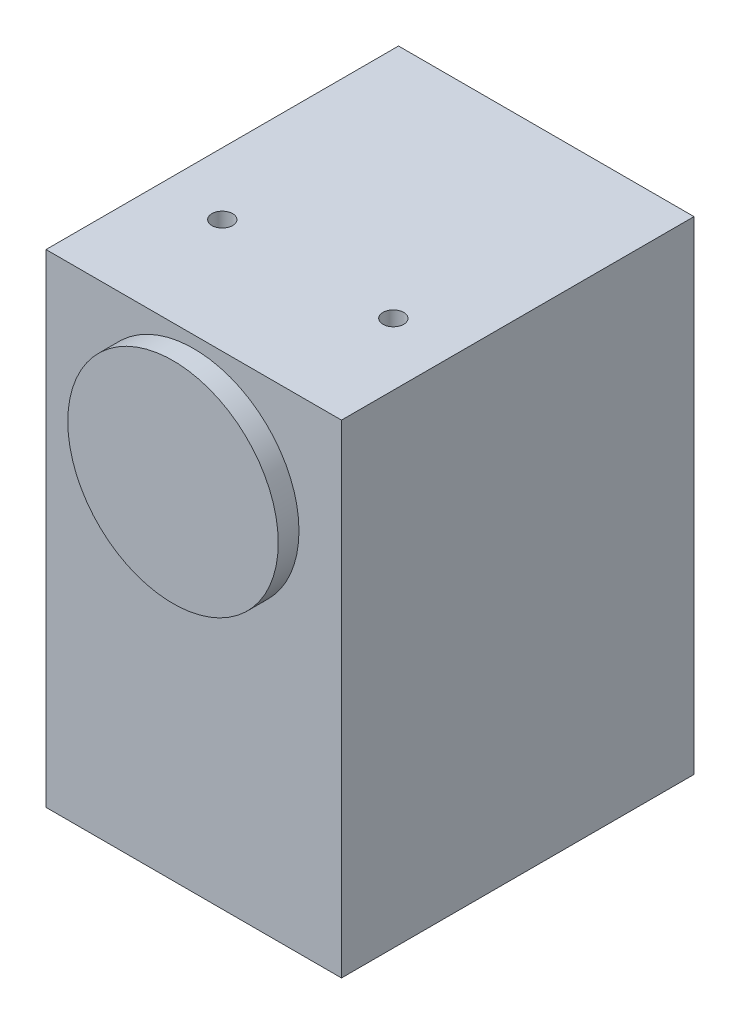
ISO-10303-21;
HEADER;
FILE_DESCRIPTION(('STEP AP214'),'2;1');
FILE_NAME('part.step','',(''),(''),'','','');
FILE_SCHEMA(('AUTOMOTIVE_DESIGN { 1 0 10303 214 1 1 1 1 }'));
ENDSEC;
DATA;
#1=APPLICATION_CONTEXT('core data for automotive mechanical design processes');
#2=APPLICATION_PROTOCOL_DEFINITION('international standard','automotive_design',2000,#1);
#3=PRODUCT_CONTEXT('',#1,'mechanical');
#4=PRODUCT('Part','Part','',(#3));
#5=PRODUCT_RELATED_PRODUCT_CATEGORY('part','',(#4));
#6=PRODUCT_DEFINITION_FORMATION('','',#4);
#7=PRODUCT_DEFINITION_CONTEXT('part definition',#1,'design');
#8=PRODUCT_DEFINITION('design','',#6,#7);
#9=PRODUCT_DEFINITION_SHAPE('','',#8);
#10=(LENGTH_UNIT() NAMED_UNIT(*) SI_UNIT(.MILLI.,.METRE.));
#11=(NAMED_UNIT(*) PLANE_ANGLE_UNIT() SI_UNIT($,.RADIAN.));
#12=(NAMED_UNIT(*) SI_UNIT($,.STERADIAN.) SOLID_ANGLE_UNIT());
#13=UNCERTAINTY_MEASURE_WITH_UNIT(LENGTH_MEASURE(1.E-05),#10,'distance_accuracy_value','');
#14=(GEOMETRIC_REPRESENTATION_CONTEXT(3) GLOBAL_UNCERTAINTY_ASSIGNED_CONTEXT((#13)) GLOBAL_UNIT_ASSIGNED_CONTEXT((#10,
#11,#12)) REPRESENTATION_CONTEXT('',''));
#15=CARTESIAN_POINT('',(0.,0.,0.));
#16=DIRECTION('',(0.,0.,1.));
#17=DIRECTION('',(1.,0.,0.));
#18=AXIS2_PLACEMENT_3D('',#15,#16,#17);
#19=CARTESIAN_POINT('',(14.25,-23.3,34.));
#20=DIRECTION('',(-1.,0.,0.));
#21=DIRECTION('',(0.,0.,1.));
#22=AXIS2_PLACEMENT_3D('',#19,#20,#21);
#23=PLANE('',#22);
#24=DIRECTION('',(0.,1.,0.));
#25=VECTOR('',#24,1.);
#26=CARTESIAN_POINT('',(14.25,-23.3,0.));
#27=LINE('',#26,#25);
#28=CARTESIAN_POINT('',(14.25,-23.3,0.));
#29=VERTEX_POINT('',#28);
#30=CARTESIAN_POINT('',(14.25,23.3,0.));
#31=VERTEX_POINT('',#30);
#32=EDGE_CURVE('E110',#29,#31,#27,.T.);
#33=ORIENTED_EDGE('',*,*,#32,.T.);
#34=DIRECTION('',(0.,0.,-1.));
#35=VECTOR('',#34,1.);
#36=CARTESIAN_POINT('',(14.25,23.3,34.));
#37=LINE('',#36,#35);
#38=CARTESIAN_POINT('',(14.25,23.3,34.));
#39=VERTEX_POINT('',#38);
#40=EDGE_CURVE('E42',#39,#31,#37,.T.);
#41=ORIENTED_EDGE('',*,*,#40,.F.);
#42=DIRECTION('',(0.,1.,0.));
#43=VECTOR('',#42,1.);
#44=CARTESIAN_POINT('',(14.25,-23.3,34.));
#45=LINE('',#44,#43);
#46=CARTESIAN_POINT('',(14.25,-23.3,34.));
#47=VERTEX_POINT('',#46);
#48=EDGE_CURVE('E93',#47,#39,#45,.T.);
#49=ORIENTED_EDGE('',*,*,#48,.F.);
#50=DIRECTION('',(0.,0.,-1.));
#51=VECTOR('',#50,1.);
#52=CARTESIAN_POINT('',(14.25,-23.3,34.));
#53=LINE('',#52,#51);
#54=EDGE_CURVE('E106',#47,#29,#53,.T.);
#55=ORIENTED_EDGE('',*,*,#54,.T.);
#56=EDGE_LOOP('',(#33,#41,#49,#55));
#57=FACE_BOUND('',#56,.T.);
#58=ADVANCED_FACE('F39',(#57),#23,.F.);
#59=CARTESIAN_POINT('',(-14.25,23.3,34.));
#60=DIRECTION('',(0.,-1.,0.));
#61=DIRECTION('',(0.,0.,-1.));
#62=AXIS2_PLACEMENT_3D('',#59,#60,#61);
#63=PLANE('',#62);
#64=CARTESIAN_POINT('',(-8.24999999999999,23.3,23.));
#65=DIRECTION('',(0.,1.,0.));
#66=DIRECTION('',(0.,0.,1.));
#67=AXIS2_PLACEMENT_3D('',#64,#65,#66);
#68=CIRCLE('',#67,1.);
#69=CARTESIAN_POINT('',(-8.24999999999999,23.3,24.));
#70=VERTEX_POINT('',#69);
#71=EDGE_CURVE('E143',#70,#70,#68,.T.);
#72=ORIENTED_EDGE('',*,*,#71,.F.);
#73=EDGE_LOOP('',(#72));
#74=FACE_BOUND('',#73,.T.);
#75=CARTESIAN_POINT('',(8.25000000000001,23.3,23.));
#76=DIRECTION('',(0.,1.,0.));
#77=DIRECTION('',(0.,0.,1.));
#78=AXIS2_PLACEMENT_3D('',#75,#76,#77);
#79=CIRCLE('',#78,1.);
#80=CARTESIAN_POINT('',(8.25000000000001,23.3,24.));
#81=VERTEX_POINT('',#80);
#82=EDGE_CURVE('E135',#81,#81,#79,.T.);
#83=ORIENTED_EDGE('',*,*,#82,.F.);
#84=EDGE_LOOP('',(#83));
#85=FACE_BOUND('',#84,.T.);
#86=DIRECTION('',(-1.,0.,0.));
#87=VECTOR('',#86,1.);
#88=CARTESIAN_POINT('',(-14.25,23.3,0.));
#89=LINE('',#88,#87);
#90=CARTESIAN_POINT('',(-14.25,23.3,0.));
#91=VERTEX_POINT('',#90);
#92=EDGE_CURVE('E99',#31,#91,#89,.T.);
#93=ORIENTED_EDGE('',*,*,#92,.T.);
#94=DIRECTION('',(0.,0.,-1.));
#95=VECTOR('',#94,1.);
#96=CARTESIAN_POINT('',(-14.25,23.3,34.));
#97=LINE('',#96,#95);
#98=CARTESIAN_POINT('',(-14.25,23.3,34.));
#99=VERTEX_POINT('',#98);
#100=EDGE_CURVE('E97',#99,#91,#97,.T.);
#101=ORIENTED_EDGE('',*,*,#100,.F.);
#102=DIRECTION('',(-1.,0.,0.));
#103=VECTOR('',#102,1.);
#104=CARTESIAN_POINT('',(-14.25,23.3,34.));
#105=LINE('',#104,#103);
#106=EDGE_CURVE('E88',#39,#99,#105,.T.);
#107=ORIENTED_EDGE('',*,*,#106,.F.);
#108=ORIENTED_EDGE('',*,*,#40,.T.);
#109=EDGE_LOOP('',(#93,#101,#107,#108));
#110=FACE_BOUND('',#109,.T.);
#111=ADVANCED_FACE('F98',(#74,#85,#110),#63,.F.);
#112=CARTESIAN_POINT('',(-14.25,-23.3,34.));
#113=DIRECTION('',(1.,0.,0.));
#114=DIRECTION('',(0.,0.,-1.));
#115=AXIS2_PLACEMENT_3D('',#112,#113,#114);
#116=PLANE('',#115);
#117=DIRECTION('',(0.,-1.,0.));
#118=VECTOR('',#117,1.);
#119=CARTESIAN_POINT('',(-14.25,-23.3,0.));
#120=LINE('',#119,#118);
#121=CARTESIAN_POINT('',(-14.25,-23.3,0.));
#122=VERTEX_POINT('',#121);
#123=EDGE_CURVE('E74',#91,#122,#120,.T.);
#124=ORIENTED_EDGE('',*,*,#123,.T.);
#125=DIRECTION('',(0.,0.,-1.));
#126=VECTOR('',#125,1.);
#127=CARTESIAN_POINT('',(-14.25,-23.3,34.));
#128=LINE('',#127,#126);
#129=CARTESIAN_POINT('',(-14.25,-23.3,34.));
#130=VERTEX_POINT('',#129);
#131=EDGE_CURVE('E101',#130,#122,#128,.T.);
#132=ORIENTED_EDGE('',*,*,#131,.F.);
#133=DIRECTION('',(0.,-1.,0.));
#134=VECTOR('',#133,1.);
#135=CARTESIAN_POINT('',(-14.25,-23.3,34.));
#136=LINE('',#135,#134);
#137=EDGE_CURVE('E91',#99,#130,#136,.T.);
#138=ORIENTED_EDGE('',*,*,#137,.F.);
#139=ORIENTED_EDGE('',*,*,#100,.T.);
#140=EDGE_LOOP('',(#124,#132,#138,#139));
#141=FACE_BOUND('',#140,.T.);
#142=ADVANCED_FACE('F102',(#141),#116,.F.);
#143=CARTESIAN_POINT('',(-14.25,-23.3,34.));
#144=DIRECTION('',(0.,1.,0.));
#145=DIRECTION('',(0.,0.,1.));
#146=AXIS2_PLACEMENT_3D('',#143,#144,#145);
#147=PLANE('',#146);
#148=DIRECTION('',(1.,0.,0.));
#149=VECTOR('',#148,1.);
#150=CARTESIAN_POINT('',(-14.25,-23.3,0.));
#151=LINE('',#150,#149);
#152=EDGE_CURVE('E80',#122,#29,#151,.T.);
#153=ORIENTED_EDGE('',*,*,#152,.T.);
#154=ORIENTED_EDGE('',*,*,#54,.F.);
#155=DIRECTION('',(1.,0.,0.));
#156=VECTOR('',#155,1.);
#157=CARTESIAN_POINT('',(-14.25,-23.3,34.));
#158=LINE('',#157,#156);
#159=EDGE_CURVE('E57',#130,#47,#158,.T.);
#160=ORIENTED_EDGE('',*,*,#159,.F.);
#161=ORIENTED_EDGE('',*,*,#131,.T.);
#162=EDGE_LOOP('',(#153,#154,#160,#161));
#163=FACE_BOUND('',#162,.T.);
#164=ADVANCED_FACE('F124',(#163),#147,.F.);
#165=CARTESIAN_POINT('',(0.,0.,34.));
#166=DIRECTION('',(0.,0.,-1.));
#167=DIRECTION('',(-1.,0.,0.));
#168=AXIS2_PLACEMENT_3D('',#165,#166,#167);
#169=PLANE('',#168);
#170=CARTESIAN_POINT('',(0.,12.,34.));
#171=DIRECTION('',(0.,0.,1.));
#172=DIRECTION('',(1.,0.,0.));
#173=AXIS2_PLACEMENT_3D('',#170,#171,#172);
#174=CIRCLE('',#173,10.15);
#175=CARTESIAN_POINT('',(10.15,12.,34.));
#176=VERTEX_POINT('',#175);
#177=EDGE_CURVE('E11',#176,#176,#174,.T.);
#178=ORIENTED_EDGE('',*,*,#177,.F.);
#179=EDGE_LOOP('',(#178));
#180=FACE_BOUND('',#179,.T.);
#181=ORIENTED_EDGE('',*,*,#48,.T.);
#182=ORIENTED_EDGE('',*,*,#106,.T.);
#183=ORIENTED_EDGE('',*,*,#137,.T.);
#184=ORIENTED_EDGE('',*,*,#159,.T.);
#185=EDGE_LOOP('',(#181,#182,#183,#184));
#186=FACE_BOUND('',#185,.T.);
#187=ADVANCED_FACE('F89',(#180,#186),#169,.F.);
#188=CARTESIAN_POINT('',(0.,0.,0.));
#189=DIRECTION('',(0.,0.,-1.));
#190=DIRECTION('',(-1.,0.,0.));
#191=AXIS2_PLACEMENT_3D('',#188,#189,#190);
#192=PLANE('',#191);
#193=ORIENTED_EDGE('',*,*,#32,.F.);
#194=ORIENTED_EDGE('',*,*,#152,.F.);
#195=ORIENTED_EDGE('',*,*,#123,.F.);
#196=ORIENTED_EDGE('',*,*,#92,.F.);
#197=EDGE_LOOP('',(#193,#194,#195,#196));
#198=FACE_BOUND('',#197,.T.);
#199=ADVANCED_FACE('F127',(#198),#192,.T.);
#200=CARTESIAN_POINT('',(0.,12.,36.));
#201=DIRECTION('',(0.,0.,-1.));
#202=DIRECTION('',(-1.,0.,0.));
#203=AXIS2_PLACEMENT_3D('',#200,#201,#202);
#204=CYLINDRICAL_SURFACE('',#203,10.15);
#205=CARTESIAN_POINT('',(0.,12.,36.));
#206=DIRECTION('',(0.,0.,1.));
#207=DIRECTION('',(1.,0.,0.));
#208=AXIS2_PLACEMENT_3D('',#205,#206,#207);
#209=CIRCLE('',#208,10.15);
#210=CARTESIAN_POINT('',(10.15,12.,36.));
#211=VERTEX_POINT('',#210);
#212=EDGE_CURVE('E114',#211,#211,#209,.T.);
#213=ORIENTED_EDGE('',*,*,#212,.F.);
#214=EDGE_LOOP('',(#213));
#215=FACE_BOUND('',#214,.T.);
#216=ORIENTED_EDGE('',*,*,#177,.T.);
#217=EDGE_LOOP('',(#216));
#218=FACE_BOUND('',#217,.T.);
#219=ADVANCED_FACE('F175',(#215,#218),#204,.T.);
#220=CARTESIAN_POINT('',(0.,12.,36.));
#221=DIRECTION('',(0.,0.,1.));
#222=DIRECTION('',(1.,0.,0.));
#223=AXIS2_PLACEMENT_3D('',#220,#221,#222);
#224=PLANE('',#223);
#225=ORIENTED_EDGE('',*,*,#212,.T.);
#226=EDGE_LOOP('',(#225));
#227=FACE_BOUND('',#226,.T.);
#228=ADVANCED_FACE('F166',(#227),#224,.T.);
#229=CARTESIAN_POINT('',(8.25000000000001,21.3,23.));
#230=DIRECTION('',(0.,1.,0.));
#231=DIRECTION('',(0.,0.,1.));
#232=AXIS2_PLACEMENT_3D('',#229,#230,#231);
#233=CYLINDRICAL_SURFACE('',#232,1.);
#234=CARTESIAN_POINT('',(8.25000000000001,21.3,23.));
#235=DIRECTION('',(0.,1.,0.));
#236=DIRECTION('',(0.,0.,1.));
#237=AXIS2_PLACEMENT_3D('',#234,#235,#236);
#238=CIRCLE('',#237,1.);
#239=CARTESIAN_POINT('',(8.25000000000001,21.3,24.));
#240=VERTEX_POINT('',#239);
#241=EDGE_CURVE('E139',#240,#240,#238,.T.);
#242=ORIENTED_EDGE('',*,*,#241,.F.);
#243=EDGE_LOOP('',(#242));
#244=FACE_BOUND('',#243,.T.);
#245=ORIENTED_EDGE('',*,*,#82,.T.);
#246=EDGE_LOOP('',(#245));
#247=FACE_BOUND('',#246,.T.);
#248=ADVANCED_FACE('F164',(#244,#247),#233,.F.);
#249=CARTESIAN_POINT('',(8.25000000000001,21.3,23.));
#250=DIRECTION('',(0.,1.,0.));
#251=DIRECTION('',(0.,0.,1.));
#252=AXIS2_PLACEMENT_3D('',#249,#250,#251);
#253=PLANE('',#252);
#254=ORIENTED_EDGE('',*,*,#241,.T.);
#255=EDGE_LOOP('',(#254));
#256=FACE_BOUND('',#255,.T.);
#257=ADVANCED_FACE('F156',(#256),#253,.T.);
#258=CARTESIAN_POINT('',(-8.24999999999999,21.3,23.));
#259=DIRECTION('',(0.,1.,0.));
#260=DIRECTION('',(0.,0.,1.));
#261=AXIS2_PLACEMENT_3D('',#258,#259,#260);
#262=CYLINDRICAL_SURFACE('',#261,1.);
#263=CARTESIAN_POINT('',(-8.24999999999999,21.3,23.));
#264=DIRECTION('',(0.,1.,0.));
#265=DIRECTION('',(0.,0.,1.));
#266=AXIS2_PLACEMENT_3D('',#263,#264,#265);
#267=CIRCLE('',#266,1.);
#268=CARTESIAN_POINT('',(-8.24999999999999,21.3,24.));
#269=VERTEX_POINT('',#268);
#270=EDGE_CURVE('E134',#269,#269,#267,.T.);
#271=ORIENTED_EDGE('',*,*,#270,.F.);
#272=EDGE_LOOP('',(#271));
#273=FACE_BOUND('',#272,.T.);
#274=ORIENTED_EDGE('',*,*,#71,.T.);
#275=EDGE_LOOP('',(#274));
#276=FACE_BOUND('',#275,.T.);
#277=ADVANCED_FACE('F153',(#273,#276),#262,.F.);
#278=CARTESIAN_POINT('',(-8.24999999999999,21.3,23.));
#279=DIRECTION('',(0.,1.,0.));
#280=DIRECTION('',(0.,0.,1.));
#281=AXIS2_PLACEMENT_3D('',#278,#279,#280);
#282=PLANE('',#281);
#283=ORIENTED_EDGE('',*,*,#270,.T.);
#284=EDGE_LOOP('',(#283));
#285=FACE_BOUND('',#284,.T.);
#286=ADVANCED_FACE('F151',(#285),#282,.T.);
#287=CLOSED_SHELL('',(#58,#111,#142,#164,#187,#199,#219,#228,#248,#257,#277,#286));
#288=MANIFOLD_SOLID_BREP('B2',#287);
#289=ADVANCED_BREP_SHAPE_REPRESENTATION('',(#18,#288),#14);
#290=SHAPE_DEFINITION_REPRESENTATION(#9,#289);
ENDSEC;
END-ISO-10303-21;
